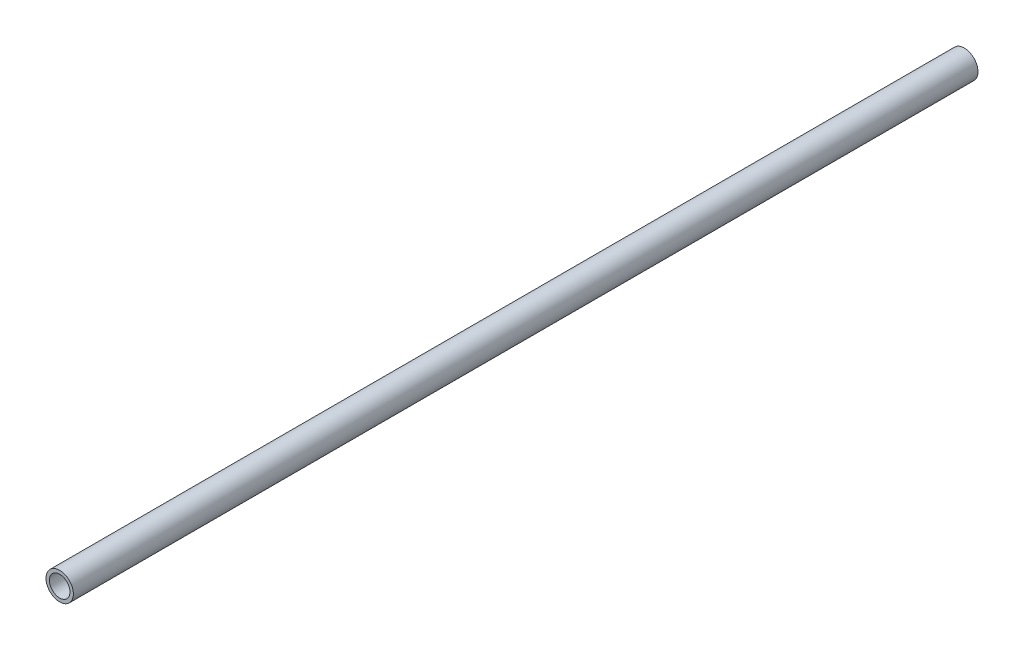
ISO-10303-21;
HEADER;
FILE_DESCRIPTION(('STEP AP214'),'2;1');
FILE_NAME('part.step','',(''),(''),'','','');
FILE_SCHEMA(('AUTOMOTIVE_DESIGN { 1 0 10303 214 1 1 1 1 }'));
ENDSEC;
DATA;
#1=APPLICATION_CONTEXT('core data for automotive mechanical design processes');
#2=APPLICATION_PROTOCOL_DEFINITION('international standard','automotive_design',2000,#1);
#3=PRODUCT_CONTEXT('',#1,'mechanical');
#4=PRODUCT('Part','Part','',(#3));
#5=PRODUCT_RELATED_PRODUCT_CATEGORY('part','',(#4));
#6=PRODUCT_DEFINITION_FORMATION('','',#4);
#7=PRODUCT_DEFINITION_CONTEXT('part definition',#1,'design');
#8=PRODUCT_DEFINITION('design','',#6,#7);
#9=PRODUCT_DEFINITION_SHAPE('','',#8);
#10=(LENGTH_UNIT() NAMED_UNIT(*) SI_UNIT(.MILLI.,.METRE.));
#11=(NAMED_UNIT(*) PLANE_ANGLE_UNIT() SI_UNIT($,.RADIAN.));
#12=(NAMED_UNIT(*) SI_UNIT($,.STERADIAN.) SOLID_ANGLE_UNIT());
#13=UNCERTAINTY_MEASURE_WITH_UNIT(LENGTH_MEASURE(1.E-05),#10,'distance_accuracy_value','');
#14=(GEOMETRIC_REPRESENTATION_CONTEXT(3) GLOBAL_UNCERTAINTY_ASSIGNED_CONTEXT((#13)) GLOBAL_UNIT_ASSIGNED_CONTEXT((#10,
#11,#12)) REPRESENTATION_CONTEXT('',''));
#15=CARTESIAN_POINT('',(0.,0.,0.));
#16=DIRECTION('',(0.,0.,1.));
#17=DIRECTION('',(1.,0.,0.));
#18=AXIS2_PLACEMENT_3D('',#15,#16,#17);
#19=CARTESIAN_POINT('',(0.,0.,939.8));
#20=DIRECTION('',(0.,0.,-1.));
#21=DIRECTION('',(-1.,0.,0.));
#22=AXIS2_PLACEMENT_3D('',#19,#20,#21);
#23=CYLINDRICAL_SURFACE('',#22,14.224);
#24=CARTESIAN_POINT('',(0.,0.,939.8));
#25=DIRECTION('',(0.,0.,1.));
#26=DIRECTION('',(1.,0.,0.));
#27=AXIS2_PLACEMENT_3D('',#24,#25,#26);
#28=CIRCLE('',#27,14.224);
#29=CARTESIAN_POINT('',(14.224,0.,939.8));
#30=VERTEX_POINT('',#29);
#31=EDGE_CURVE('E10',#30,#30,#28,.T.);
#32=ORIENTED_EDGE('',*,*,#31,.F.);
#33=EDGE_LOOP('',(#32));
#34=FACE_BOUND('',#33,.T.);
#35=CARTESIAN_POINT('',(0.,0.,0.));
#36=DIRECTION('',(0.,0.,1.));
#37=DIRECTION('',(1.,0.,0.));
#38=AXIS2_PLACEMENT_3D('',#35,#36,#37);
#39=CIRCLE('',#38,14.224);
#40=CARTESIAN_POINT('',(14.224,0.,0.));
#41=VERTEX_POINT('',#40);
#42=EDGE_CURVE('E34',#41,#41,#39,.T.);
#43=ORIENTED_EDGE('',*,*,#42,.T.);
#44=EDGE_LOOP('',(#43));
#45=FACE_BOUND('',#44,.T.);
#46=ADVANCED_FACE('F31',(#34,#45),#23,.T.);
#47=CARTESIAN_POINT('',(0.,0.,939.8));
#48=DIRECTION('',(0.,0.,1.));
#49=DIRECTION('',(1.,0.,0.));
#50=AXIS2_PLACEMENT_3D('',#47,#48,#49);
#51=PLANE('',#50);
#52=CARTESIAN_POINT('',(0.,0.,939.8));
#53=DIRECTION('',(0.,0.,1.));
#54=DIRECTION('',(1.,0.,0.));
#55=AXIS2_PLACEMENT_3D('',#52,#53,#54);
#56=CIRCLE('',#55,10.6934);
#57=CARTESIAN_POINT('',(10.6934,0.,939.8));
#58=VERTEX_POINT('',#57);
#59=EDGE_CURVE('E43',#58,#58,#56,.T.);
#60=ORIENTED_EDGE('',*,*,#59,.F.);
#61=EDGE_LOOP('',(#60));
#62=FACE_BOUND('',#61,.T.);
#63=ORIENTED_EDGE('',*,*,#31,.T.);
#64=EDGE_LOOP('',(#63));
#65=FACE_BOUND('',#64,.T.);
#66=ADVANCED_FACE('F58',(#62,#65),#51,.T.);
#67=CARTESIAN_POINT('',(0.,0.,0.));
#68=DIRECTION('',(0.,0.,1.));
#69=DIRECTION('',(1.,0.,0.));
#70=AXIS2_PLACEMENT_3D('',#67,#68,#69);
#71=PLANE('',#70);
#72=CARTESIAN_POINT('',(0.,0.,0.));
#73=DIRECTION('',(0.,0.,1.));
#74=DIRECTION('',(1.,0.,0.));
#75=AXIS2_PLACEMENT_3D('',#72,#73,#74);
#76=CIRCLE('',#75,10.6934);
#77=CARTESIAN_POINT('',(10.6934,0.,0.));
#78=VERTEX_POINT('',#77);
#79=EDGE_CURVE('E41',#78,#78,#76,.T.);
#80=ORIENTED_EDGE('',*,*,#79,.T.);
#81=EDGE_LOOP('',(#80));
#82=FACE_BOUND('',#81,.T.);
#83=ORIENTED_EDGE('',*,*,#42,.F.);
#84=EDGE_LOOP('',(#83));
#85=FACE_BOUND('',#84,.T.);
#86=ADVANCED_FACE('F49',(#82,#85),#71,.F.);
#87=CARTESIAN_POINT('',(0.,0.,0.));
#88=DIRECTION('',(0.,0.,1.));
#89=DIRECTION('',(1.,0.,0.));
#90=AXIS2_PLACEMENT_3D('',#87,#88,#89);
#91=CYLINDRICAL_SURFACE('',#90,10.6934);
#92=ORIENTED_EDGE('',*,*,#79,.F.);
#93=EDGE_LOOP('',(#92));
#94=FACE_BOUND('',#93,.T.);
#95=ORIENTED_EDGE('',*,*,#59,.T.);
#96=EDGE_LOOP('',(#95));
#97=FACE_BOUND('',#96,.T.);
#98=ADVANCED_FACE('F52',(#94,#97),#91,.F.);
#99=CLOSED_SHELL('',(#46,#66,#86,#98));
#100=MANIFOLD_SOLID_BREP('B2',#99);
#101=ADVANCED_BREP_SHAPE_REPRESENTATION('',(#18,#100),#14);
#102=SHAPE_DEFINITION_REPRESENTATION(#9,#101);
ENDSEC;
END-ISO-10303-21;
